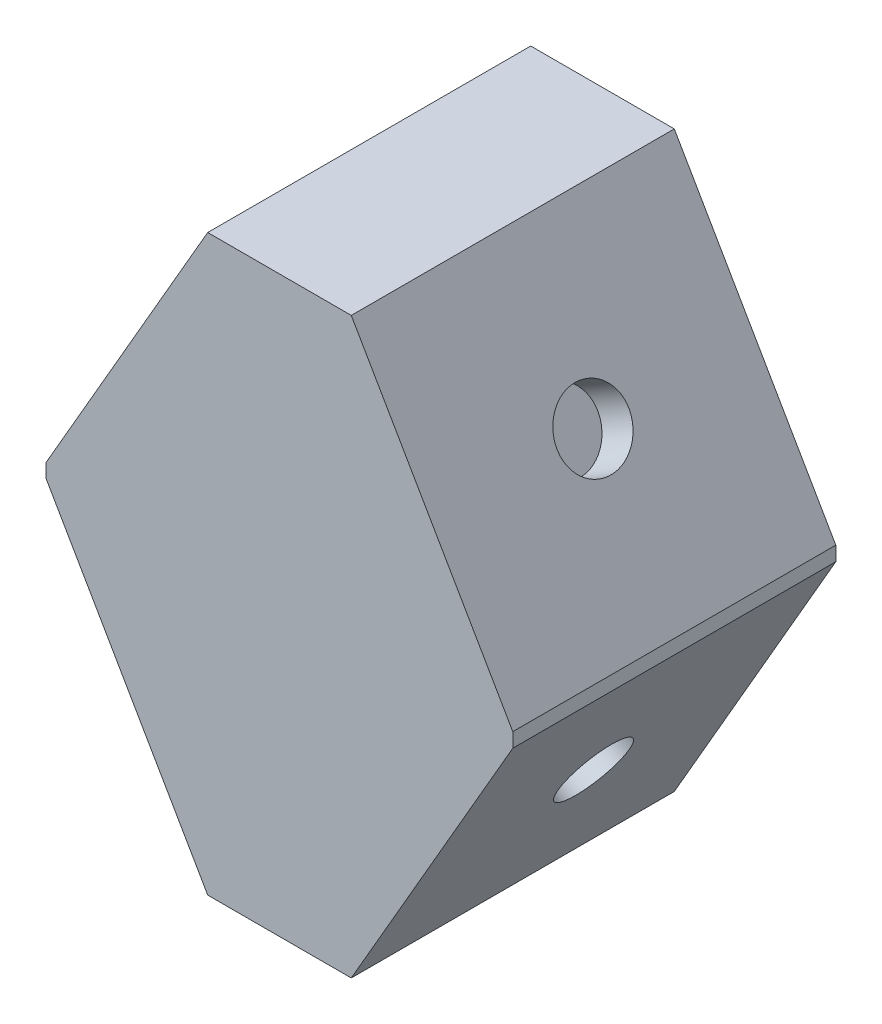
ISO-10303-21;
HEADER;
FILE_DESCRIPTION(('STEP AP214'),'2;1');
FILE_NAME('part.step','',(''),(''),'','','');
FILE_SCHEMA(('AUTOMOTIVE_DESIGN { 1 0 10303 214 1 1 1 1 }'));
ENDSEC;
DATA;
#1=APPLICATION_CONTEXT('core data for automotive mechanical design processes');
#2=APPLICATION_PROTOCOL_DEFINITION('international standard','automotive_design',2000,#1);
#3=PRODUCT_CONTEXT('',#1,'mechanical');
#4=PRODUCT('Part','Part','',(#3));
#5=PRODUCT_RELATED_PRODUCT_CATEGORY('part','',(#4));
#6=PRODUCT_DEFINITION_FORMATION('','',#4);
#7=PRODUCT_DEFINITION_CONTEXT('part definition',#1,'design');
#8=PRODUCT_DEFINITION('design','',#6,#7);
#9=PRODUCT_DEFINITION_SHAPE('','',#8);
#10=(LENGTH_UNIT() NAMED_UNIT(*) SI_UNIT(.MILLI.,.METRE.));
#11=(NAMED_UNIT(*) PLANE_ANGLE_UNIT() SI_UNIT($,.RADIAN.));
#12=(NAMED_UNIT(*) SI_UNIT($,.STERADIAN.) SOLID_ANGLE_UNIT());
#13=UNCERTAINTY_MEASURE_WITH_UNIT(LENGTH_MEASURE(1.E-05),#10,'distance_accuracy_value','');
#14=(GEOMETRIC_REPRESENTATION_CONTEXT(3) GLOBAL_UNCERTAINTY_ASSIGNED_CONTEXT((#13)) GLOBAL_UNIT_ASSIGNED_CONTEXT((#10,
#11,#12)) REPRESENTATION_CONTEXT('',''));
#15=CARTESIAN_POINT('',(0.,0.,0.));
#16=DIRECTION('',(0.,0.,1.));
#17=DIRECTION('',(1.,0.,0.));
#18=AXIS2_PLACEMENT_3D('',#15,#16,#17);
#19=CARTESIAN_POINT('',(-9.99999999999913,39.9711431702991,45.));
#20=DIRECTION('',(0.866025403784425,-0.500000000000023,0.));
#21=DIRECTION('',(0.500000000000024,0.866025403784425,0.));
#22=AXIS2_PLACEMENT_3D('',#19,#20,#21);
#23=PLANE('',#22);
#24=CARTESIAN_POINT('',(-21.2499999999997,20.4855715851496,22.5));
#25=DIRECTION('',(-0.866025403784425,0.500000000000023,0.));
#26=DIRECTION('',(-0.500000000000023,-0.866025403784425,0.));
#27=AXIS2_PLACEMENT_3D('',#24,#25,#26);
#28=CIRCLE('',#27,5.);
#29=CARTESIAN_POINT('',(-23.7499999999998,16.1554445662274,22.5));
#30=VERTEX_POINT('',#29);
#31=EDGE_CURVE('E183',#30,#30,#28,.T.);
#32=ORIENTED_EDGE('',*,*,#31,.F.);
#33=EDGE_LOOP('',(#32));
#34=FACE_BOUND('',#33,.T.);
#35=DIRECTION('',(-0.500000000000024,-0.866025403784425,0.));
#36=VECTOR('',#35,1.);
#37=CARTESIAN_POINT('',(-9.99999999999913,39.9711431702991,0.));
#38=LINE('',#37,#36);
#39=CARTESIAN_POINT('',(-9.99999999999913,39.9711431702991,0.));
#40=VERTEX_POINT('',#39);
#41=CARTESIAN_POINT('',(-32.5000000000002,0.999999999999999,0.));
#42=VERTEX_POINT('',#41);
#43=EDGE_CURVE('E129',#40,#42,#38,.T.);
#44=ORIENTED_EDGE('',*,*,#43,.T.);
#45=DIRECTION('',(0.,0.,-1.));
#46=VECTOR('',#45,1.);
#47=CARTESIAN_POINT('',(-32.5000000000002,0.999999999999999,45.));
#48=LINE('',#47,#46);
#49=CARTESIAN_POINT('',(-32.5000000000002,0.999999999999999,45.));
#50=VERTEX_POINT('',#49);
#51=EDGE_CURVE('E11',#50,#42,#48,.T.);
#52=ORIENTED_EDGE('',*,*,#51,.F.);
#53=DIRECTION('',(-0.500000000000024,-0.866025403784425,0.));
#54=VECTOR('',#53,1.);
#55=CARTESIAN_POINT('',(-9.99999999999913,39.9711431702991,45.));
#56=LINE('',#55,#54);
#57=CARTESIAN_POINT('',(-9.99999999999913,39.9711431702991,45.));
#58=VERTEX_POINT('',#57);
#59=EDGE_CURVE('E144',#58,#50,#56,.T.);
#60=ORIENTED_EDGE('',*,*,#59,.F.);
#61=DIRECTION('',(0.,0.,-1.));
#62=VECTOR('',#61,1.);
#63=CARTESIAN_POINT('',(-9.99999999999913,39.9711431702991,45.));
#64=LINE('',#63,#62);
#65=EDGE_CURVE('E125',#58,#40,#64,.T.);
#66=ORIENTED_EDGE('',*,*,#65,.T.);
#67=EDGE_LOOP('',(#44,#52,#60,#66));
#68=FACE_BOUND('',#67,.T.);
#69=ADVANCED_FACE('F33',(#34,#68),#23,.F.);
#70=CARTESIAN_POINT('',(-32.5000000000002,0.999999999999999,45.));
#71=DIRECTION('',(1.,0.,0.));
#72=DIRECTION('',(0.,1.,0.));
#73=AXIS2_PLACEMENT_3D('',#70,#71,#72);
#74=PLANE('',#73);
#75=DIRECTION('',(0.,-1.,0.));
#76=VECTOR('',#75,1.);
#77=CARTESIAN_POINT('',(-32.5000000000002,0.999999999999999,0.));
#78=LINE('',#77,#76);
#79=CARTESIAN_POINT('',(-32.5000000000002,-0.999999999999999,0.));
#80=VERTEX_POINT('',#79);
#81=EDGE_CURVE('E132',#42,#80,#78,.T.);
#82=ORIENTED_EDGE('',*,*,#81,.T.);
#83=DIRECTION('',(0.,0.,-1.));
#84=VECTOR('',#83,1.);
#85=CARTESIAN_POINT('',(-32.5000000000002,-0.999999999999999,45.));
#86=LINE('',#85,#84);
#87=CARTESIAN_POINT('',(-32.5000000000002,-0.999999999999999,45.));
#88=VERTEX_POINT('',#87);
#89=EDGE_CURVE('E41',#88,#80,#86,.T.);
#90=ORIENTED_EDGE('',*,*,#89,.F.);
#91=DIRECTION('',(0.,-1.,0.));
#92=VECTOR('',#91,1.);
#93=CARTESIAN_POINT('',(-32.5000000000002,0.999999999999999,45.));
#94=LINE('',#93,#92);
#95=EDGE_CURVE('E92',#50,#88,#94,.T.);
#96=ORIENTED_EDGE('',*,*,#95,.F.);
#97=ORIENTED_EDGE('',*,*,#51,.T.);
#98=EDGE_LOOP('',(#82,#90,#96,#97));
#99=FACE_BOUND('',#98,.T.);
#100=ADVANCED_FACE('F219',(#99),#74,.F.);
#101=CARTESIAN_POINT('',(-9.99999999999988,-39.9711431702995,45.));
#102=DIRECTION('',(0.866025403784434,0.500000000000007,0.));
#103=DIRECTION('',(-0.500000000000007,0.866025403784434,0.));
#104=AXIS2_PLACEMENT_3D('',#101,#102,#103);
#105=PLANE('',#104);
#106=CARTESIAN_POINT('',(-21.2500000000001,-20.4855715851498,22.5));
#107=DIRECTION('',(-0.866025403784434,-0.500000000000008,0.));
#108=DIRECTION('',(0.500000000000008,-0.866025403784434,0.));
#109=AXIS2_PLACEMENT_3D('',#106,#107,#108);
#110=CIRCLE('',#109,5.);
#111=CARTESIAN_POINT('',(-18.75,-24.8156986040719,22.5));
#112=VERTEX_POINT('',#111);
#113=EDGE_CURVE('E189',#112,#112,#110,.T.);
#114=ORIENTED_EDGE('',*,*,#113,.F.);
#115=EDGE_LOOP('',(#114));
#116=FACE_BOUND('',#115,.T.);
#117=DIRECTION('',(0.500000000000007,-0.866025403784434,0.));
#118=VECTOR('',#117,1.);
#119=CARTESIAN_POINT('',(-9.99999999999988,-39.9711431702995,0.));
#120=LINE('',#119,#118);
#121=CARTESIAN_POINT('',(-9.99999999999988,-39.9711431702995,0.));
#122=VERTEX_POINT('',#121);
#123=EDGE_CURVE('E135',#80,#122,#120,.T.);
#124=ORIENTED_EDGE('',*,*,#123,.T.);
#125=DIRECTION('',(0.,0.,-1.));
#126=VECTOR('',#125,1.);
#127=CARTESIAN_POINT('',(-9.99999999999988,-39.9711431702995,45.));
#128=LINE('',#127,#126);
#129=CARTESIAN_POINT('',(-9.99999999999988,-39.9711431702995,45.));
#130=VERTEX_POINT('',#129);
#131=EDGE_CURVE('E151',#130,#122,#128,.T.);
#132=ORIENTED_EDGE('',*,*,#131,.F.);
#133=DIRECTION('',(0.500000000000007,-0.866025403784434,0.));
#134=VECTOR('',#133,1.);
#135=CARTESIAN_POINT('',(-9.99999999999988,-39.9711431702995,45.));
#136=LINE('',#135,#134);
#137=EDGE_CURVE('E159',#88,#130,#136,.T.);
#138=ORIENTED_EDGE('',*,*,#137,.F.);
#139=ORIENTED_EDGE('',*,*,#89,.T.);
#140=EDGE_LOOP('',(#124,#132,#138,#139));
#141=FACE_BOUND('',#140,.T.);
#142=ADVANCED_FACE('F157',(#116,#141),#105,.F.);
#143=CARTESIAN_POINT('',(-9.99999999999988,-39.9711431702995,45.));
#144=DIRECTION('',(0.,1.,0.));
#145=DIRECTION('',(-1.,0.,0.));
#146=AXIS2_PLACEMENT_3D('',#143,#144,#145);
#147=PLANE('',#146);
#148=DIRECTION('',(1.,0.,0.));
#149=VECTOR('',#148,1.);
#150=CARTESIAN_POINT('',(-9.99999999999988,-39.9711431702995,0.));
#151=LINE('',#150,#149);
#152=CARTESIAN_POINT('',(9.99999999999994,-39.9711431702996,0.));
#153=VERTEX_POINT('',#152);
#154=EDGE_CURVE('E137',#122,#153,#151,.T.);
#155=ORIENTED_EDGE('',*,*,#154,.T.);
#156=DIRECTION('',(0.,0.,-1.));
#157=VECTOR('',#156,1.);
#158=CARTESIAN_POINT('',(9.99999999999994,-39.9711431702996,45.));
#159=LINE('',#158,#157);
#160=CARTESIAN_POINT('',(9.99999999999994,-39.9711431702996,45.));
#161=VERTEX_POINT('',#160);
#162=EDGE_CURVE('E148',#161,#153,#159,.T.);
#163=ORIENTED_EDGE('',*,*,#162,.F.);
#164=DIRECTION('',(1.,0.,0.));
#165=VECTOR('',#164,1.);
#166=CARTESIAN_POINT('',(-9.99999999999988,-39.9711431702995,45.));
#167=LINE('',#166,#165);
#168=EDGE_CURVE('E171',#130,#161,#167,.T.);
#169=ORIENTED_EDGE('',*,*,#168,.F.);
#170=ORIENTED_EDGE('',*,*,#131,.T.);
#171=EDGE_LOOP('',(#155,#163,#169,#170));
#172=FACE_BOUND('',#171,.T.);
#173=ADVANCED_FACE('F167',(#172),#147,.F.);
#174=CARTESIAN_POINT('',(9.99999999999994,-39.9711431702996,45.));
#175=DIRECTION('',(-0.866025403784436,0.500000000000004,0.));
#176=DIRECTION('',(-0.500000000000004,-0.866025403784436,0.));
#177=AXIS2_PLACEMENT_3D('',#174,#175,#176);
#178=PLANE('',#177);
#179=CARTESIAN_POINT('',(21.25,-20.4855715851498,22.5));
#180=DIRECTION('',(0.866025403784436,-0.500000000000004,0.));
#181=DIRECTION('',(0.500000000000004,0.866025403784436,0.));
#182=AXIS2_PLACEMENT_3D('',#179,#180,#181);
#183=CIRCLE('',#182,5.);
#184=CARTESIAN_POINT('',(23.7500000000001,-16.1554445662277,22.5));
#185=VERTEX_POINT('',#184);
#186=EDGE_CURVE('E195',#185,#185,#183,.T.);
#187=ORIENTED_EDGE('',*,*,#186,.F.);
#188=EDGE_LOOP('',(#187));
#189=FACE_BOUND('',#188,.T.);
#190=DIRECTION('',(0.500000000000004,0.866025403784436,0.));
#191=VECTOR('',#190,1.);
#192=CARTESIAN_POINT('',(9.99999999999994,-39.9711431702996,0.));
#193=LINE('',#192,#191);
#194=CARTESIAN_POINT('',(32.5000000000001,-0.999999999999999,0.));
#195=VERTEX_POINT('',#194);
#196=EDGE_CURVE('E139',#153,#195,#193,.T.);
#197=ORIENTED_EDGE('',*,*,#196,.T.);
#198=DIRECTION('',(0.,0.,-1.));
#199=VECTOR('',#198,1.);
#200=CARTESIAN_POINT('',(32.5000000000001,-0.999999999999999,45.));
#201=LINE('',#200,#199);
#202=CARTESIAN_POINT('',(32.5000000000001,-0.999999999999999,45.));
#203=VERTEX_POINT('',#202);
#204=EDGE_CURVE('E120',#203,#195,#201,.T.);
#205=ORIENTED_EDGE('',*,*,#204,.F.);
#206=DIRECTION('',(0.500000000000004,0.866025403784436,0.));
#207=VECTOR('',#206,1.);
#208=CARTESIAN_POINT('',(9.99999999999994,-39.9711431702996,45.));
#209=LINE('',#208,#207);
#210=EDGE_CURVE('E111',#161,#203,#209,.T.);
#211=ORIENTED_EDGE('',*,*,#210,.F.);
#212=ORIENTED_EDGE('',*,*,#162,.T.);
#213=EDGE_LOOP('',(#197,#205,#211,#212));
#214=FACE_BOUND('',#213,.T.);
#215=ADVANCED_FACE('F170',(#189,#214),#178,.F.);
#216=CARTESIAN_POINT('',(32.5000000000002,0.999999999999999,45.));
#217=DIRECTION('',(-1.,0.,0.));
#218=DIRECTION('',(0.,-1.,0.));
#219=AXIS2_PLACEMENT_3D('',#216,#217,#218);
#220=PLANE('',#219);
#221=DIRECTION('',(0.,1.,0.));
#222=VECTOR('',#221,1.);
#223=CARTESIAN_POINT('',(32.5000000000002,0.999999999999999,0.));
#224=LINE('',#223,#222);
#225=CARTESIAN_POINT('',(32.5000000000002,0.999999999999999,0.));
#226=VERTEX_POINT('',#225);
#227=EDGE_CURVE('E119',#195,#226,#224,.T.);
#228=ORIENTED_EDGE('',*,*,#227,.T.);
#229=DIRECTION('',(0.,0.,-1.));
#230=VECTOR('',#229,1.);
#231=CARTESIAN_POINT('',(32.5000000000002,0.999999999999999,45.));
#232=LINE('',#231,#230);
#233=CARTESIAN_POINT('',(32.5000000000002,0.999999999999999,45.));
#234=VERTEX_POINT('',#233);
#235=EDGE_CURVE('E116',#234,#226,#232,.T.);
#236=ORIENTED_EDGE('',*,*,#235,.F.);
#237=DIRECTION('',(0.,1.,0.));
#238=VECTOR('',#237,1.);
#239=CARTESIAN_POINT('',(32.5000000000002,0.999999999999999,45.));
#240=LINE('',#239,#238);
#241=EDGE_CURVE('E105',#203,#234,#240,.T.);
#242=ORIENTED_EDGE('',*,*,#241,.F.);
#243=ORIENTED_EDGE('',*,*,#204,.T.);
#244=EDGE_LOOP('',(#228,#236,#242,#243));
#245=FACE_BOUND('',#244,.T.);
#246=ADVANCED_FACE('F117',(#245),#220,.F.);
#247=CARTESIAN_POINT('',(9.99999999999999,39.9711431702996,45.));
#248=DIRECTION('',(-0.866025403784436,-0.500000000000004,0.));
#249=DIRECTION('',(0.500000000000004,-0.866025403784436,0.));
#250=AXIS2_PLACEMENT_3D('',#247,#248,#249);
#251=PLANE('',#250);
#252=CARTESIAN_POINT('',(21.1670407822125,20.6292611653141,22.5));
#253=DIRECTION('',(0.866025403784436,0.500000000000004,0.));
#254=DIRECTION('',(-0.500000000000004,0.866025403784436,0.));
#255=AXIS2_PLACEMENT_3D('',#252,#253,#254);
#256=CIRCLE('',#255,5.);
#257=CARTESIAN_POINT('',(18.6670407822125,24.9593881842363,22.5));
#258=VERTEX_POINT('',#257);
#259=EDGE_CURVE('E177',#258,#258,#256,.T.);
#260=ORIENTED_EDGE('',*,*,#259,.F.);
#261=EDGE_LOOP('',(#260));
#262=FACE_BOUND('',#261,.T.);
#263=DIRECTION('',(-0.500000000000004,0.866025403784436,0.));
#264=VECTOR('',#263,1.);
#265=CARTESIAN_POINT('',(9.99999999999999,39.9711431702996,0.));
#266=LINE('',#265,#264);
#267=CARTESIAN_POINT('',(9.99999999999999,39.9711431702996,0.));
#268=VERTEX_POINT('',#267);
#269=EDGE_CURVE('E78',#226,#268,#266,.T.);
#270=ORIENTED_EDGE('',*,*,#269,.T.);
#271=DIRECTION('',(0.,0.,-1.));
#272=VECTOR('',#271,1.);
#273=CARTESIAN_POINT('',(9.99999999999999,39.9711431702996,45.));
#274=LINE('',#273,#272);
#275=CARTESIAN_POINT('',(9.99999999999999,39.9711431702996,45.));
#276=VERTEX_POINT('',#275);
#277=EDGE_CURVE('E121',#276,#268,#274,.T.);
#278=ORIENTED_EDGE('',*,*,#277,.F.);
#279=DIRECTION('',(-0.500000000000004,0.866025403784436,0.));
#280=VECTOR('',#279,1.);
#281=CARTESIAN_POINT('',(9.99999999999999,39.9711431702996,45.));
#282=LINE('',#281,#280);
#283=EDGE_CURVE('E109',#234,#276,#282,.T.);
#284=ORIENTED_EDGE('',*,*,#283,.F.);
#285=ORIENTED_EDGE('',*,*,#235,.T.);
#286=EDGE_LOOP('',(#270,#278,#284,#285));
#287=FACE_BOUND('',#286,.T.);
#288=ADVANCED_FACE('F123',(#262,#287),#251,.F.);
#289=CARTESIAN_POINT('',(-9.99999999999913,39.9711431702991,45.));
#290=DIRECTION('',(0.,-1.,0.));
#291=DIRECTION('',(1.,0.,0.));
#292=AXIS2_PLACEMENT_3D('',#289,#290,#291);
#293=PLANE('',#292);
#294=DIRECTION('',(-1.,0.,0.));
#295=VECTOR('',#294,1.);
#296=CARTESIAN_POINT('',(-9.99999999999913,39.9711431702991,0.));
#297=LINE('',#296,#295);
#298=EDGE_CURVE('E84',#268,#40,#297,.T.);
#299=ORIENTED_EDGE('',*,*,#298,.T.);
#300=ORIENTED_EDGE('',*,*,#65,.F.);
#301=DIRECTION('',(-1.,0.,0.));
#302=VECTOR('',#301,1.);
#303=CARTESIAN_POINT('',(-9.99999999999913,39.9711431702991,45.));
#304=LINE('',#303,#302);
#305=EDGE_CURVE('E49',#276,#58,#304,.T.);
#306=ORIENTED_EDGE('',*,*,#305,.F.);
#307=ORIENTED_EDGE('',*,*,#277,.T.);
#308=EDGE_LOOP('',(#299,#300,#306,#307));
#309=FACE_BOUND('',#308,.T.);
#310=ADVANCED_FACE('F228',(#309),#293,.F.);
#311=CARTESIAN_POINT('',(0.,0.,45.));
#312=DIRECTION('',(0.,0.,-1.));
#313=DIRECTION('',(-1.,0.,0.));
#314=AXIS2_PLACEMENT_3D('',#311,#312,#313);
#315=PLANE('',#314);
#316=ORIENTED_EDGE('',*,*,#59,.T.);
#317=ORIENTED_EDGE('',*,*,#95,.T.);
#318=ORIENTED_EDGE('',*,*,#137,.T.);
#319=ORIENTED_EDGE('',*,*,#168,.T.);
#320=ORIENTED_EDGE('',*,*,#210,.T.);
#321=ORIENTED_EDGE('',*,*,#241,.T.);
#322=ORIENTED_EDGE('',*,*,#283,.T.);
#323=ORIENTED_EDGE('',*,*,#305,.T.);
#324=EDGE_LOOP('',(#316,#317,#318,#319,#320,#321,#322,#323));
#325=FACE_BOUND('',#324,.T.);
#326=ADVANCED_FACE('F107',(#325),#315,.F.);
#327=CARTESIAN_POINT('',(0.,0.,0.));
#328=DIRECTION('',(0.,0.,-1.));
#329=DIRECTION('',(-1.,0.,0.));
#330=AXIS2_PLACEMENT_3D('',#327,#328,#329);
#331=PLANE('',#330);
#332=ORIENTED_EDGE('',*,*,#43,.F.);
#333=ORIENTED_EDGE('',*,*,#298,.F.);
#334=ORIENTED_EDGE('',*,*,#269,.F.);
#335=ORIENTED_EDGE('',*,*,#227,.F.);
#336=ORIENTED_EDGE('',*,*,#196,.F.);
#337=ORIENTED_EDGE('',*,*,#154,.F.);
#338=ORIENTED_EDGE('',*,*,#123,.F.);
#339=ORIENTED_EDGE('',*,*,#81,.F.);
#340=EDGE_LOOP('',(#332,#333,#334,#335,#336,#337,#338,#339));
#341=FACE_BOUND('',#340,.T.);
#342=ADVANCED_FACE('F163',(#341),#331,.T.);
#343=CARTESIAN_POINT('',(16.8369137632903,18.1292611653141,22.5));
#344=DIRECTION('',(0.866025403784436,0.500000000000004,0.));
#345=DIRECTION('',(-0.500000000000004,0.866025403784436,0.));
#346=AXIS2_PLACEMENT_3D('',#343,#344,#345);
#347=CYLINDRICAL_SURFACE('',#346,5.);
#348=CARTESIAN_POINT('',(16.8369137632903,18.1292611653141,22.5));
#349=DIRECTION('',(0.866025403784436,0.500000000000004,0.));
#350=DIRECTION('',(-0.500000000000004,0.866025403784436,0.));
#351=AXIS2_PLACEMENT_3D('',#348,#349,#350);
#352=CIRCLE('',#351,5.);
#353=CARTESIAN_POINT('',(14.3369137632903,22.4593881842363,22.5));
#354=VERTEX_POINT('',#353);
#355=EDGE_CURVE('E133',#354,#354,#352,.T.);
#356=ORIENTED_EDGE('',*,*,#355,.F.);
#357=EDGE_LOOP('',(#356));
#358=FACE_BOUND('',#357,.T.);
#359=ORIENTED_EDGE('',*,*,#259,.T.);
#360=EDGE_LOOP('',(#359));
#361=FACE_BOUND('',#360,.T.);
#362=ADVANCED_FACE('F240',(#358,#361),#347,.F.);
#363=CARTESIAN_POINT('',(16.8369137632903,18.1292611653141,22.5));
#364=DIRECTION('',(0.866025403784436,0.500000000000004,0.));
#365=DIRECTION('',(-0.500000000000004,0.866025403784436,0.));
#366=AXIS2_PLACEMENT_3D('',#363,#364,#365);
#367=PLANE('',#366);
#368=ORIENTED_EDGE('',*,*,#355,.T.);
#369=EDGE_LOOP('',(#368));
#370=FACE_BOUND('',#369,.T.);
#371=ADVANCED_FACE('F244',(#370),#367,.T.);
#372=CARTESIAN_POINT('',(-16.9198729810775,17.9855715851495,22.5));
#373=DIRECTION('',(-0.866025403784425,0.500000000000023,0.));
#374=DIRECTION('',(-0.500000000000023,-0.866025403784425,0.));
#375=AXIS2_PLACEMENT_3D('',#372,#373,#374);
#376=CYLINDRICAL_SURFACE('',#375,5.);
#377=CARTESIAN_POINT('',(-16.9198729810775,17.9855715851495,22.5));
#378=DIRECTION('',(-0.866025403784425,0.500000000000023,0.));
#379=DIRECTION('',(-0.500000000000023,-0.866025403784425,0.));
#380=AXIS2_PLACEMENT_3D('',#377,#378,#379);
#381=CIRCLE('',#380,5.);
#382=CARTESIAN_POINT('',(-19.4198729810776,13.6554445662273,22.5));
#383=VERTEX_POINT('',#382);
#384=EDGE_CURVE('E180',#383,#383,#381,.T.);
#385=ORIENTED_EDGE('',*,*,#384,.F.);
#386=EDGE_LOOP('',(#385));
#387=FACE_BOUND('',#386,.T.);
#388=ORIENTED_EDGE('',*,*,#31,.T.);
#389=EDGE_LOOP('',(#388));
#390=FACE_BOUND('',#389,.T.);
#391=ADVANCED_FACE('F248',(#387,#390),#376,.F.);
#392=CARTESIAN_POINT('',(-16.9198729810775,17.9855715851495,22.5));
#393=DIRECTION('',(-0.866025403784425,0.500000000000023,0.));
#394=DIRECTION('',(-0.500000000000023,-0.866025403784425,0.));
#395=AXIS2_PLACEMENT_3D('',#392,#393,#394);
#396=PLANE('',#395);
#397=ORIENTED_EDGE('',*,*,#384,.T.);
#398=EDGE_LOOP('',(#397));
#399=FACE_BOUND('',#398,.T.);
#400=ADVANCED_FACE('F252',(#399),#396,.T.);
#401=CARTESIAN_POINT('',(-16.9198729810779,-17.9855715851497,22.5));
#402=DIRECTION('',(-0.866025403784434,-0.500000000000008,0.));
#403=DIRECTION('',(0.500000000000008,-0.866025403784434,0.));
#404=AXIS2_PLACEMENT_3D('',#401,#402,#403);
#405=CYLINDRICAL_SURFACE('',#404,5.);
#406=CARTESIAN_POINT('',(-16.9198729810779,-17.9855715851497,22.5));
#407=DIRECTION('',(-0.866025403784434,-0.500000000000008,0.));
#408=DIRECTION('',(0.500000000000008,-0.866025403784434,0.));
#409=AXIS2_PLACEMENT_3D('',#406,#407,#408);
#410=CIRCLE('',#409,5.);
#411=CARTESIAN_POINT('',(-14.4198729810778,-22.3156986040719,22.5));
#412=VERTEX_POINT('',#411);
#413=EDGE_CURVE('E186',#412,#412,#410,.T.);
#414=ORIENTED_EDGE('',*,*,#413,.F.);
#415=EDGE_LOOP('',(#414));
#416=FACE_BOUND('',#415,.T.);
#417=ORIENTED_EDGE('',*,*,#113,.T.);
#418=EDGE_LOOP('',(#417));
#419=FACE_BOUND('',#418,.T.);
#420=ADVANCED_FACE('F256',(#416,#419),#405,.F.);
#421=CARTESIAN_POINT('',(-16.9198729810779,-17.9855715851497,22.5));
#422=DIRECTION('',(-0.866025403784434,-0.500000000000008,0.));
#423=DIRECTION('',(0.500000000000008,-0.866025403784434,0.));
#424=AXIS2_PLACEMENT_3D('',#421,#422,#423);
#425=PLANE('',#424);
#426=ORIENTED_EDGE('',*,*,#413,.T.);
#427=EDGE_LOOP('',(#426));
#428=FACE_BOUND('',#427,.T.);
#429=ADVANCED_FACE('F206',(#428),#425,.T.);
#430=CARTESIAN_POINT('',(16.9198729810779,-17.9855715851498,22.5));
#431=DIRECTION('',(0.866025403784436,-0.500000000000004,0.));
#432=DIRECTION('',(0.500000000000004,0.866025403784436,0.));
#433=AXIS2_PLACEMENT_3D('',#430,#431,#432);
#434=CYLINDRICAL_SURFACE('',#433,5.);
#435=CARTESIAN_POINT('',(16.9198729810779,-17.9855715851498,22.5));
#436=DIRECTION('',(0.866025403784436,-0.500000000000004,0.));
#437=DIRECTION('',(0.500000000000004,0.866025403784436,0.));
#438=AXIS2_PLACEMENT_3D('',#435,#436,#437);
#439=CIRCLE('',#438,5.);
#440=CARTESIAN_POINT('',(19.4198729810779,-13.6554445662276,22.5));
#441=VERTEX_POINT('',#440);
#442=EDGE_CURVE('E192',#441,#441,#439,.T.);
#443=ORIENTED_EDGE('',*,*,#442,.F.);
#444=EDGE_LOOP('',(#443));
#445=FACE_BOUND('',#444,.T.);
#446=ORIENTED_EDGE('',*,*,#186,.T.);
#447=EDGE_LOOP('',(#446));
#448=FACE_BOUND('',#447,.T.);
#449=ADVANCED_FACE('F203',(#445,#448),#434,.F.);
#450=CARTESIAN_POINT('',(16.9198729810779,-17.9855715851498,22.5));
#451=DIRECTION('',(0.866025403784436,-0.500000000000004,0.));
#452=DIRECTION('',(0.500000000000004,0.866025403784436,0.));
#453=AXIS2_PLACEMENT_3D('',#450,#451,#452);
#454=PLANE('',#453);
#455=ORIENTED_EDGE('',*,*,#442,.T.);
#456=EDGE_LOOP('',(#455));
#457=FACE_BOUND('',#456,.T.);
#458=ADVANCED_FACE('F201',(#457),#454,.T.);
#459=CLOSED_SHELL('',(#69,#100,#142,#173,#215,#246,#288,#310,#326,#342,#362,#371,#391,#400,#420,
#429,#449,#458));
#460=MANIFOLD_SOLID_BREP('B2',#459);
#461=ADVANCED_BREP_SHAPE_REPRESENTATION('',(#18,#460),#14);
#462=SHAPE_DEFINITION_REPRESENTATION(#9,#461);
ENDSEC;
END-ISO-10303-21;
